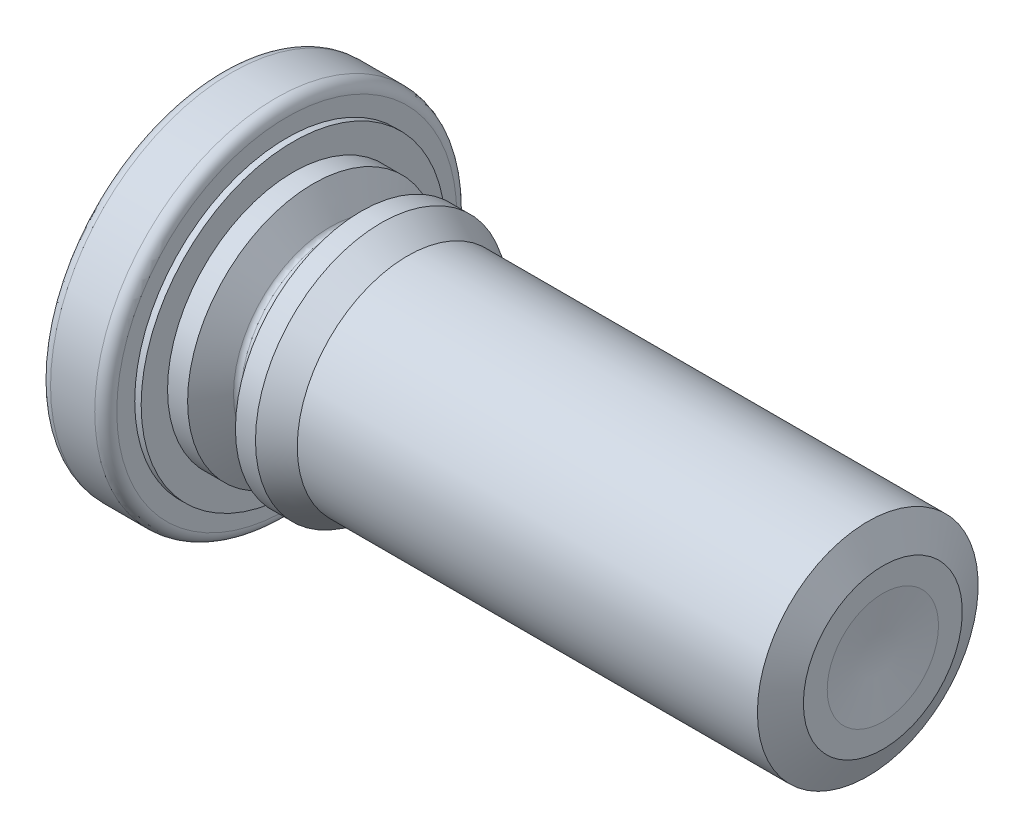
ISO-10303-21;
HEADER;
FILE_DESCRIPTION(('STEP AP214'),'2;1');
FILE_NAME('part.step','',(''),(''),'','','');
FILE_SCHEMA(('AUTOMOTIVE_DESIGN { 1 0 10303 214 1 1 1 1 }'));
ENDSEC;
DATA;
#1=APPLICATION_CONTEXT('core data for automotive mechanical design processes');
#2=APPLICATION_PROTOCOL_DEFINITION('international standard','automotive_design',2000,#1);
#3=PRODUCT_CONTEXT('',#1,'mechanical');
#4=PRODUCT('Part','Part','',(#3));
#5=PRODUCT_RELATED_PRODUCT_CATEGORY('part','',(#4));
#6=PRODUCT_DEFINITION_FORMATION('','',#4);
#7=PRODUCT_DEFINITION_CONTEXT('part definition',#1,'design');
#8=PRODUCT_DEFINITION('design','',#6,#7);
#9=PRODUCT_DEFINITION_SHAPE('','',#8);
#10=(LENGTH_UNIT() NAMED_UNIT(*) SI_UNIT(.MILLI.,.METRE.));
#11=(NAMED_UNIT(*) PLANE_ANGLE_UNIT() SI_UNIT($,.RADIAN.));
#12=(NAMED_UNIT(*) SI_UNIT($,.STERADIAN.) SOLID_ANGLE_UNIT());
#13=UNCERTAINTY_MEASURE_WITH_UNIT(LENGTH_MEASURE(1.E-05),#10,'distance_accuracy_value','');
#14=(GEOMETRIC_REPRESENTATION_CONTEXT(3) GLOBAL_UNCERTAINTY_ASSIGNED_CONTEXT((#13)) GLOBAL_UNIT_ASSIGNED_CONTEXT((#10,
#11,#12)) REPRESENTATION_CONTEXT('',''));
#15=CARTESIAN_POINT('',(0.,0.,0.));
#16=DIRECTION('',(0.,0.,1.));
#17=DIRECTION('',(1.,0.,0.));
#18=AXIS2_PLACEMENT_3D('',#15,#16,#17);
#19=CARTESIAN_POINT('',(4.65410143219124,0.,0.));
#20=DIRECTION('',(1.,0.,0.));
#21=DIRECTION('',(0.,0.,-1.));
#22=AXIS2_PLACEMENT_3D('',#19,#20,#21);
#23=CONICAL_SURFACE('',#22,0.,1.43613496866935);
#24=CARTESIAN_POINT('',(4.7625,0.,0.));
#25=DIRECTION('',(-1.,0.,0.));
#26=DIRECTION('',(0.,0.,1.));
#27=AXIS2_PLACEMENT_3D('',#24,#25,#26);
#28=CIRCLE('',#27,0.800099999999998);
#29=CARTESIAN_POINT('',(4.7625,0.,0.800099999999998));
#30=VERTEX_POINT('',#29);
#31=EDGE_CURVE('E94',#30,#30,#28,.T.);
#32=ORIENTED_EDGE('',*,*,#31,.F.);
#33=EDGE_LOOP('',(#32));
#34=FACE_BOUND('',#33,.T.);
#35=CARTESIAN_POINT('',(4.65410143219124,0.,0.));
#36=VERTEX_POINT('',#35);
#37=VERTEX_LOOP('',#36);
#38=FACE_BOUND('',#37,.T.);
#39=ADVANCED_FACE('F32',(#34,#38),#23,.F.);
#40=CARTESIAN_POINT('',(4.7625,1.143,0.));
#41=DIRECTION('',(-1.,0.,0.));
#42=DIRECTION('',(0.,0.,1.));
#43=AXIS2_PLACEMENT_3D('',#40,#41,#42);
#44=PLANE('',#43);
#45=CARTESIAN_POINT('',(4.7625,0.,0.));
#46=DIRECTION('',(-1.,0.,0.));
#47=DIRECTION('',(0.,0.,1.));
#48=AXIS2_PLACEMENT_3D('',#45,#46,#47);
#49=CIRCLE('',#48,1.143);
#50=CARTESIAN_POINT('',(4.7625,0.,1.143));
#51=VERTEX_POINT('',#50);
#52=EDGE_CURVE('E97',#51,#51,#49,.T.);
#53=ORIENTED_EDGE('',*,*,#52,.F.);
#54=EDGE_LOOP('',(#53));
#55=FACE_BOUND('',#54,.T.);
#56=ORIENTED_EDGE('',*,*,#31,.T.);
#57=EDGE_LOOP('',(#56));
#58=FACE_BOUND('',#57,.T.);
#59=ADVANCED_FACE('F43',(#55,#58),#44,.F.);
#60=CARTESIAN_POINT('',(4.7625,0.,0.));
#61=DIRECTION('',(-1.,0.,0.));
#62=DIRECTION('',(0.,0.,1.));
#63=AXIS2_PLACEMENT_3D('',#60,#61,#62);
#64=CONICAL_SURFACE('',#63,1.143,1.11701072127638);
#65=CARTESIAN_POINT('',(4.54570286438248,0.,0.));
#66=DIRECTION('',(-1.,0.,0.));
#67=DIRECTION('',(0.,0.,1.));
#68=AXIS2_PLACEMENT_3D('',#65,#66,#67);
#69=CIRCLE('',#68,1.5875);
#70=CARTESIAN_POINT('',(4.54570286438248,0.,1.5875));
#71=VERTEX_POINT('',#70);
#72=EDGE_CURVE('E100',#71,#71,#69,.T.);
#73=ORIENTED_EDGE('',*,*,#72,.F.);
#74=EDGE_LOOP('',(#73));
#75=FACE_BOUND('',#74,.T.);
#76=ORIENTED_EDGE('',*,*,#52,.T.);
#77=EDGE_LOOP('',(#76));
#78=FACE_BOUND('',#77,.T.);
#79=ADVANCED_FACE('F49',(#75,#78),#64,.T.);
#80=CARTESIAN_POINT('',(-4.7625,0.,0.));
#81=DIRECTION('',(-1.,0.,0.));
#82=DIRECTION('',(0.,0.,1.));
#83=AXIS2_PLACEMENT_3D('',#80,#81,#82);
#84=CYLINDRICAL_SURFACE('',#83,1.5875);
#85=CARTESIAN_POINT('',(-2.07185694015437,0.,0.));
#86=DIRECTION('',(-1.,0.,0.));
#87=DIRECTION('',(0.,0.,1.));
#88=AXIS2_PLACEMENT_3D('',#85,#86,#87);
#89=CIRCLE('',#88,1.5875);
#90=CARTESIAN_POINT('',(-2.07185694015437,0.,1.5875));
#91=VERTEX_POINT('',#90);
#92=EDGE_CURVE('E103',#91,#91,#89,.T.);
#93=ORIENTED_EDGE('',*,*,#92,.F.);
#94=EDGE_LOOP('',(#93));
#95=FACE_BOUND('',#94,.T.);
#96=ORIENTED_EDGE('',*,*,#72,.T.);
#97=EDGE_LOOP('',(#96));
#98=FACE_BOUND('',#97,.T.);
#99=ADVANCED_FACE('F166',(#95,#98),#84,.T.);
#100=CARTESIAN_POINT('',(-2.07185694015437,0.,0.));
#101=DIRECTION('',(-1.,0.,0.));
#102=DIRECTION('',(0.,0.,1.));
#103=AXIS2_PLACEMENT_3D('',#100,#101,#102);
#104=CONICAL_SURFACE('',#103,1.5875,0.523598775598292);
#105=CARTESIAN_POINT('',(-2.45285694015437,0.,0.));
#106=DIRECTION('',(-1.,0.,0.));
#107=DIRECTION('',(0.,0.,1.));
#108=AXIS2_PLACEMENT_3D('',#105,#106,#107);
#109=CIRCLE('',#108,1.80747045256124);
#110=CARTESIAN_POINT('',(-2.45285694015437,0.,1.80747045256124));
#111=VERTEX_POINT('',#110);
#112=EDGE_CURVE('E106',#111,#111,#109,.T.);
#113=ORIENTED_EDGE('',*,*,#112,.F.);
#114=EDGE_LOOP('',(#113));
#115=FACE_BOUND('',#114,.T.);
#116=ORIENTED_EDGE('',*,*,#92,.T.);
#117=EDGE_LOOP('',(#116));
#118=FACE_BOUND('',#117,.T.);
#119=ADVANCED_FACE('F162',(#115,#118),#104,.T.);
#120=CARTESIAN_POINT('',(-4.7625,0.,0.));
#121=DIRECTION('',(-1.,0.,0.));
#122=DIRECTION('',(0.,0.,1.));
#123=AXIS2_PLACEMENT_3D('',#120,#121,#122);
#124=CYLINDRICAL_SURFACE('',#123,1.80747045256124);
#125=CARTESIAN_POINT('',(-2.74128693429845,0.,0.));
#126=DIRECTION('',(-1.,0.,0.));
#127=DIRECTION('',(0.,0.,1.));
#128=AXIS2_PLACEMENT_3D('',#125,#126,#127);
#129=CIRCLE('',#128,1.80747045256124);
#130=CARTESIAN_POINT('',(-2.74128693429845,0.,1.80747045256124));
#131=VERTEX_POINT('',#130);
#132=EDGE_CURVE('E109',#131,#131,#129,.T.);
#133=ORIENTED_EDGE('',*,*,#132,.F.);
#134=EDGE_LOOP('',(#133));
#135=FACE_BOUND('',#134,.T.);
#136=ORIENTED_EDGE('',*,*,#112,.T.);
#137=EDGE_LOOP('',(#136));
#138=FACE_BOUND('',#137,.T.);
#139=ADVANCED_FACE('F158',(#135,#138),#124,.T.);
#140=CARTESIAN_POINT('',(-2.74128693429845,0.,0.));
#141=DIRECTION('',(1.,0.,0.));
#142=DIRECTION('',(0.,0.,-1.));
#143=AXIS2_PLACEMENT_3D('',#140,#141,#142);
#144=CONICAL_SURFACE('',#143,1.80747045256124,1.0471975511966);
#145=CARTESIAN_POINT('',(-2.98285487834076,0.,0.));
#146=DIRECTION('',(1.,0.,0.));
#147=DIRECTION('',(0.,0.,-1.));
#148=AXIS2_PLACEMENT_3D('',#145,#146,#147);
#149=CIRCLE('',#148,1.3890625);
#150=CARTESIAN_POINT('',(-2.98285487834076,0.,-1.3890625));
#151=VERTEX_POINT('',#150);
#152=EDGE_CURVE('E39',#151,#151,#149,.T.);
#153=ORIENTED_EDGE('',*,*,#152,.T.);
#154=EDGE_LOOP('',(#153));
#155=FACE_BOUND('',#154,.T.);
#156=ORIENTED_EDGE('',*,*,#132,.T.);
#157=EDGE_LOOP('',(#156));
#158=FACE_BOUND('',#157,.T.);
#159=ADVANCED_FACE('F153',(#155,#158),#144,.T.);
#160=CARTESIAN_POINT('',(-4.7625,0.,0.));
#161=DIRECTION('',(-1.,0.,0.));
#162=DIRECTION('',(0.,0.,1.));
#163=AXIS2_PLACEMENT_3D('',#160,#161,#162);
#164=CYLINDRICAL_SURFACE('',#163,1.349375);
#165=CARTESIAN_POINT('',(-3.05159564476615,0.,0.));
#166=DIRECTION('',(-1.,0.,0.));
#167=DIRECTION('',(0.,0.,1.));
#168=AXIS2_PLACEMENT_3D('',#165,#166,#167);
#169=CIRCLE('',#168,1.349375);
#170=CARTESIAN_POINT('',(-3.05159564476615,0.,1.349375));
#171=VERTEX_POINT('',#170);
#172=EDGE_CURVE('E75',#171,#171,#169,.T.);
#173=ORIENTED_EDGE('',*,*,#172,.T.);
#174=EDGE_LOOP('',(#173));
#175=FACE_BOUND('',#174,.T.);
#176=CARTESIAN_POINT('',(-3.11869128953229,0.,0.));
#177=DIRECTION('',(-1.,0.,0.));
#178=DIRECTION('',(0.,0.,1.));
#179=AXIS2_PLACEMENT_3D('',#176,#177,#178);
#180=CIRCLE('',#179,1.349375);
#181=CARTESIAN_POINT('',(-3.11869128953229,0.,1.349375));
#182=VERTEX_POINT('',#181);
#183=EDGE_CURVE('E77',#182,#182,#180,.F.);
#184=ORIENTED_EDGE('',*,*,#183,.T.);
#185=EDGE_LOOP('',(#184));
#186=FACE_BOUND('',#185,.T.);
#187=ADVANCED_FACE('F147',(#175,#186),#164,.T.);
#188=CARTESIAN_POINT('',(-3.16451846714922,0.,0.));
#189=DIRECTION('',(-1.,0.,0.));
#190=DIRECTION('',(0.,0.,1.));
#191=AXIS2_PLACEMENT_3D('',#188,#189,#190);
#192=CONICAL_SURFACE('',#191,1.349375,1.0471975511966);
#193=CARTESIAN_POINT('',(-3.18743205595768,0.,0.));
#194=DIRECTION('',(-1.,0.,0.));
#195=DIRECTION('',(0.,0.,1.));
#196=AXIS2_PLACEMENT_3D('',#193,#194,#195);
#197=CIRCLE('',#196,1.3890625);
#198=CARTESIAN_POINT('',(-3.18743205595768,0.,1.3890625));
#199=VERTEX_POINT('',#198);
#200=EDGE_CURVE('E11',#199,#199,#197,.T.);
#201=ORIENTED_EDGE('',*,*,#200,.T.);
#202=EDGE_LOOP('',(#201));
#203=FACE_BOUND('',#202,.T.);
#204=CARTESIAN_POINT('',(-3.429,0.,0.));
#205=DIRECTION('',(-1.,0.,0.));
#206=DIRECTION('',(0.,0.,1.));
#207=AXIS2_PLACEMENT_3D('',#204,#205,#206);
#208=CIRCLE('',#207,1.80747045256124);
#209=CARTESIAN_POINT('',(-3.429,0.,1.80747045256124));
#210=VERTEX_POINT('',#209);
#211=EDGE_CURVE('E112',#210,#210,#208,.T.);
#212=ORIENTED_EDGE('',*,*,#211,.F.);
#213=EDGE_LOOP('',(#212));
#214=FACE_BOUND('',#213,.T.);
#215=ADVANCED_FACE('F142',(#203,#214),#192,.T.);
#216=CARTESIAN_POINT('',(-4.7625,0.,0.));
#217=DIRECTION('',(-1.,0.,0.));
#218=DIRECTION('',(0.,0.,1.));
#219=AXIS2_PLACEMENT_3D('',#216,#217,#218);
#220=CYLINDRICAL_SURFACE('',#219,1.80747045256124);
#221=CARTESIAN_POINT('',(-3.71742999414407,0.,0.));
#222=DIRECTION('',(-1.,0.,0.));
#223=DIRECTION('',(0.,0.,1.));
#224=AXIS2_PLACEMENT_3D('',#221,#222,#223);
#225=CIRCLE('',#224,1.80747045256124);
#226=CARTESIAN_POINT('',(-3.71742999414407,0.,1.80747045256124));
#227=VERTEX_POINT('',#226);
#228=EDGE_CURVE('E115',#227,#227,#225,.T.);
#229=ORIENTED_EDGE('',*,*,#228,.F.);
#230=EDGE_LOOP('',(#229));
#231=FACE_BOUND('',#230,.T.);
#232=ORIENTED_EDGE('',*,*,#211,.T.);
#233=EDGE_LOOP('',(#232));
#234=FACE_BOUND('',#233,.T.);
#235=ADVANCED_FACE('F136',(#231,#234),#220,.T.);
#236=CARTESIAN_POINT('',(-3.71742999414407,2.18694,0.));
#237=DIRECTION('',(-1.,0.,0.));
#238=DIRECTION('',(0.,0.,1.));
#239=AXIS2_PLACEMENT_3D('',#236,#237,#238);
#240=PLANE('',#239);
#241=CARTESIAN_POINT('',(-3.71742999414407,0.,0.));
#242=DIRECTION('',(-1.,0.,0.));
#243=DIRECTION('',(0.,0.,1.));
#244=AXIS2_PLACEMENT_3D('',#241,#242,#243);
#245=CIRCLE('',#244,2.18694);
#246=CARTESIAN_POINT('',(-3.71742999414407,0.,2.18694));
#247=VERTEX_POINT('',#246);
#248=EDGE_CURVE('E118',#247,#247,#245,.T.);
#249=ORIENTED_EDGE('',*,*,#248,.F.);
#250=EDGE_LOOP('',(#249));
#251=FACE_BOUND('',#250,.T.);
#252=ORIENTED_EDGE('',*,*,#228,.T.);
#253=EDGE_LOOP('',(#252));
#254=FACE_BOUND('',#253,.T.);
#255=ADVANCED_FACE('F130',(#251,#254),#240,.F.);
#256=CARTESIAN_POINT('',(-4.7625,0.,0.));
#257=DIRECTION('',(-1.,0.,0.));
#258=DIRECTION('',(0.,0.,1.));
#259=AXIS2_PLACEMENT_3D('',#256,#257,#258);
#260=CYLINDRICAL_SURFACE('',#259,2.18694);
#261=CARTESIAN_POINT('',(-3.81,0.,0.));
#262=DIRECTION('',(-1.,0.,0.));
#263=DIRECTION('',(0.,0.,1.));
#264=AXIS2_PLACEMENT_3D('',#261,#262,#263);
#265=CIRCLE('',#264,2.18694);
#266=CARTESIAN_POINT('',(-3.81,0.,2.18694));
#267=VERTEX_POINT('',#266);
#268=EDGE_CURVE('E121',#267,#267,#265,.T.);
#269=ORIENTED_EDGE('',*,*,#268,.F.);
#270=EDGE_LOOP('',(#269));
#271=FACE_BOUND('',#270,.T.);
#272=ORIENTED_EDGE('',*,*,#248,.T.);
#273=EDGE_LOOP('',(#272));
#274=FACE_BOUND('',#273,.T.);
#275=ADVANCED_FACE('F127',(#271,#274),#260,.T.);
#276=CARTESIAN_POINT('',(-3.81,2.6035,0.));
#277=DIRECTION('',(-1.,0.,0.));
#278=DIRECTION('',(0.,0.,1.));
#279=AXIS2_PLACEMENT_3D('',#276,#277,#278);
#280=PLANE('',#279);
#281=CARTESIAN_POINT('',(-3.81,0.,0.));
#282=DIRECTION('',(-1.,0.,0.));
#283=DIRECTION('',(0.,0.,1.));
#284=AXIS2_PLACEMENT_3D('',#281,#282,#283);
#285=CIRCLE('',#284,2.44475);
#286=CARTESIAN_POINT('',(-3.81,0.,2.44475));
#287=VERTEX_POINT('',#286);
#288=EDGE_CURVE('E85',#287,#287,#285,.F.);
#289=ORIENTED_EDGE('',*,*,#288,.T.);
#290=EDGE_LOOP('',(#289));
#291=FACE_BOUND('',#290,.T.);
#292=ORIENTED_EDGE('',*,*,#268,.T.);
#293=EDGE_LOOP('',(#292));
#294=FACE_BOUND('',#293,.T.);
#295=ADVANCED_FACE('F125',(#291,#294),#280,.F.);
#296=CARTESIAN_POINT('',(-4.7625,0.,0.));
#297=DIRECTION('',(-1.,0.,0.));
#298=DIRECTION('',(0.,0.,1.));
#299=AXIS2_PLACEMENT_3D('',#296,#297,#298);
#300=CYLINDRICAL_SURFACE('',#299,2.6035);
#301=CARTESIAN_POINT('',(-3.96875,0.,0.));
#302=DIRECTION('',(-1.,0.,0.));
#303=DIRECTION('',(0.,0.,1.));
#304=AXIS2_PLACEMENT_3D('',#301,#302,#303);
#305=CIRCLE('',#304,2.6035);
#306=CARTESIAN_POINT('',(-3.96875,0.,2.6035));
#307=VERTEX_POINT('',#306);
#308=EDGE_CURVE('E88',#307,#307,#305,.T.);
#309=ORIENTED_EDGE('',*,*,#308,.T.);
#310=EDGE_LOOP('',(#309));
#311=FACE_BOUND('',#310,.T.);
#312=CARTESIAN_POINT('',(-4.60375,0.,0.));
#313=DIRECTION('',(1.,0.,0.));
#314=DIRECTION('',(0.,0.,-1.));
#315=AXIS2_PLACEMENT_3D('',#312,#313,#314);
#316=CIRCLE('',#315,2.6035);
#317=CARTESIAN_POINT('',(-4.60375,0.,-2.6035));
#318=VERTEX_POINT('',#317);
#319=EDGE_CURVE('E91',#318,#318,#316,.T.);
#320=ORIENTED_EDGE('',*,*,#319,.T.);
#321=EDGE_LOOP('',(#320));
#322=FACE_BOUND('',#321,.T.);
#323=ADVANCED_FACE('F237',(#311,#322),#300,.T.);
#324=CARTESIAN_POINT('',(-4.7625,0.,0.));
#325=DIRECTION('',(1.,0.,0.));
#326=DIRECTION('',(0.,0.,-1.));
#327=AXIS2_PLACEMENT_3D('',#324,#325,#326);
#328=PLANE('',#327);
#329=CARTESIAN_POINT('',(-4.7625,0.,0.));
#330=DIRECTION('',(1.,0.,0.));
#331=DIRECTION('',(0.,0.,-1.));
#332=AXIS2_PLACEMENT_3D('',#329,#330,#331);
#333=CIRCLE('',#332,2.44475);
#334=CARTESIAN_POINT('',(-4.7625,0.,-2.44475));
#335=VERTEX_POINT('',#334);
#336=EDGE_CURVE('E80',#335,#335,#333,.F.);
#337=ORIENTED_EDGE('',*,*,#336,.T.);
#338=EDGE_LOOP('',(#337));
#339=FACE_BOUND('',#338,.T.);
#340=ADVANCED_FACE('F59',(#339),#328,.F.);
#341=CARTESIAN_POINT('',(-3.96875,0.,0.));
#342=DIRECTION('',(-1.,0.,0.));
#343=DIRECTION('',(0.,0.,1.));
#344=AXIS2_PLACEMENT_3D('',#341,#342,#343);
#345=TOROIDAL_SURFACE('',#344,2.44475,0.15875);
#346=ORIENTED_EDGE('',*,*,#288,.F.);
#347=EDGE_LOOP('',(#346));
#348=FACE_BOUND('',#347,.T.);
#349=ORIENTED_EDGE('',*,*,#308,.F.);
#350=EDGE_LOOP('',(#349));
#351=FACE_BOUND('',#350,.T.);
#352=ADVANCED_FACE('F55',(#348,#351),#345,.T.);
#353=CARTESIAN_POINT('',(-4.60375,0.,0.));
#354=DIRECTION('',(1.,0.,0.));
#355=DIRECTION('',(0.,0.,-1.));
#356=AXIS2_PLACEMENT_3D('',#353,#354,#355);
#357=TOROIDAL_SURFACE('',#356,2.44475,0.15875);
#358=ORIENTED_EDGE('',*,*,#319,.F.);
#359=EDGE_LOOP('',(#358));
#360=FACE_BOUND('',#359,.T.);
#361=ORIENTED_EDGE('',*,*,#336,.F.);
#362=EDGE_LOOP('',(#361));
#363=FACE_BOUND('',#362,.T.);
#364=ADVANCED_FACE('F58',(#360,#363),#357,.T.);
#365=CARTESIAN_POINT('',(-3.05159564476615,0.,0.));
#366=DIRECTION('',(-1.,0.,0.));
#367=DIRECTION('',(0.,0.,1.));
#368=AXIS2_PLACEMENT_3D('',#365,#366,#367);
#369=TOROIDAL_SURFACE('',#368,1.42875,0.079375);
#370=ORIENTED_EDGE('',*,*,#152,.F.);
#371=EDGE_LOOP('',(#370));
#372=FACE_BOUND('',#371,.T.);
#373=ORIENTED_EDGE('',*,*,#172,.F.);
#374=EDGE_LOOP('',(#373));
#375=FACE_BOUND('',#374,.T.);
#376=ADVANCED_FACE('F62',(#372,#375),#369,.F.);
#377=CARTESIAN_POINT('',(-3.11869128953229,0.,0.));
#378=DIRECTION('',(-1.,0.,0.));
#379=DIRECTION('',(0.,0.,1.));
#380=AXIS2_PLACEMENT_3D('',#377,#378,#379);
#381=TOROIDAL_SURFACE('',#380,1.42875,0.079375);
#382=ORIENTED_EDGE('',*,*,#183,.F.);
#383=EDGE_LOOP('',(#382));
#384=FACE_BOUND('',#383,.T.);
#385=ORIENTED_EDGE('',*,*,#200,.F.);
#386=EDGE_LOOP('',(#385));
#387=FACE_BOUND('',#386,.T.);
#388=ADVANCED_FACE('F34',(#384,#387),#381,.F.);
#389=CLOSED_SHELL('',(#39,#59,#79,#99,#119,#139,#159,#187,#215,#235,#255,#275,#295,#323,#340,
#352,#364,#376,#388));
#390=MANIFOLD_SOLID_BREP('B2',#389);
#391=ADVANCED_BREP_SHAPE_REPRESENTATION('',(#18,#390),#14);
#392=SHAPE_DEFINITION_REPRESENTATION(#9,#391);
ENDSEC;
END-ISO-10303-21;
